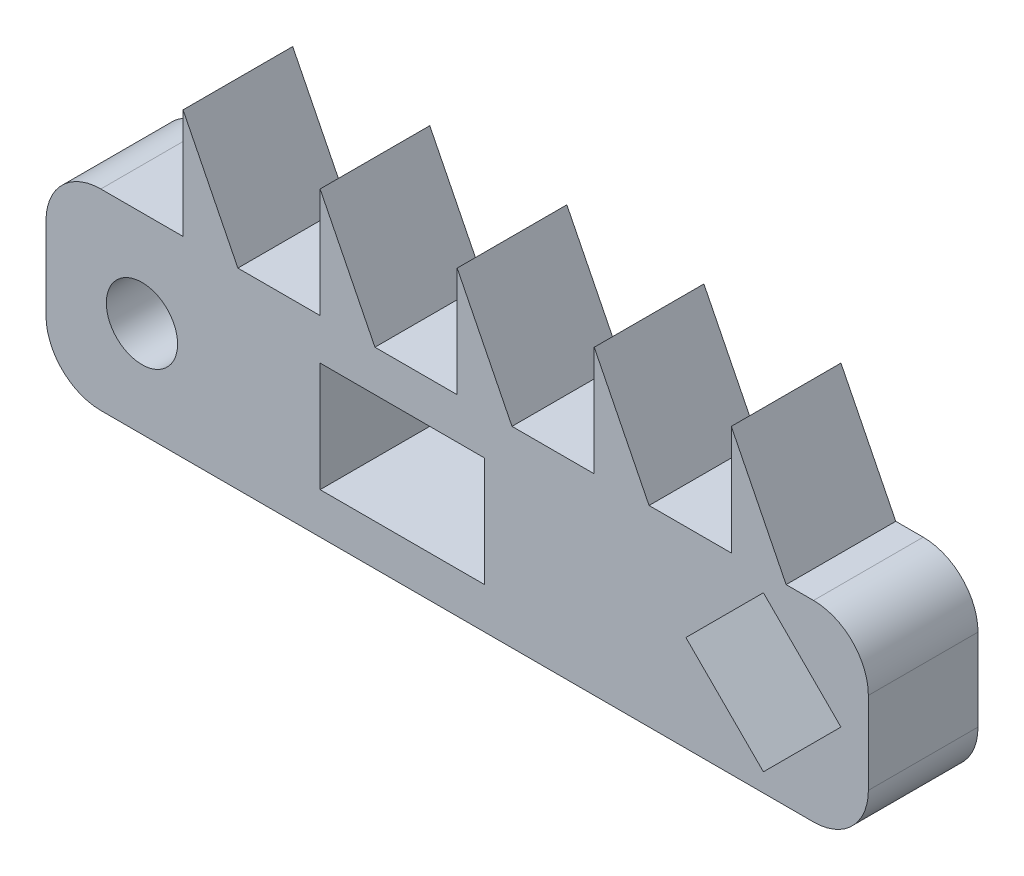
ISO-10303-21;
HEADER;
FILE_DESCRIPTION(('STEP AP214'),'2;1');
FILE_NAME('part.step','',(''),(''),'','','');
FILE_SCHEMA(('AUTOMOTIVE_DESIGN { 1 0 10303 214 1 1 1 1 }'));
ENDSEC;
DATA;
#1=APPLICATION_CONTEXT('core data for automotive mechanical design processes');
#2=APPLICATION_PROTOCOL_DEFINITION('international standard','automotive_design',2000,#1);
#3=PRODUCT_CONTEXT('',#1,'mechanical');
#4=PRODUCT('Part','Part','',(#3));
#5=PRODUCT_RELATED_PRODUCT_CATEGORY('part','',(#4));
#6=PRODUCT_DEFINITION_FORMATION('','',#4);
#7=PRODUCT_DEFINITION_CONTEXT('part definition',#1,'design');
#8=PRODUCT_DEFINITION('design','',#6,#7);
#9=PRODUCT_DEFINITION_SHAPE('','',#8);
#10=(LENGTH_UNIT() NAMED_UNIT(*) SI_UNIT(.MILLI.,.METRE.));
#11=(NAMED_UNIT(*) PLANE_ANGLE_UNIT() SI_UNIT($,.RADIAN.));
#12=(NAMED_UNIT(*) SI_UNIT($,.STERADIAN.) SOLID_ANGLE_UNIT());
#13=UNCERTAINTY_MEASURE_WITH_UNIT(LENGTH_MEASURE(1.E-05),#10,'distance_accuracy_value','');
#14=(GEOMETRIC_REPRESENTATION_CONTEXT(3) GLOBAL_UNCERTAINTY_ASSIGNED_CONTEXT((#13)) GLOBAL_UNIT_ASSIGNED_CONTEXT((#10,
#11,#12)) REPRESENTATION_CONTEXT('',''));
#15=CARTESIAN_POINT('',(0.,0.,0.));
#16=DIRECTION('',(0.,0.,1.));
#17=DIRECTION('',(1.,0.,0.));
#18=AXIS2_PLACEMENT_3D('',#15,#16,#17);
#19=CARTESIAN_POINT('',(2.00000000000001,7.,4.));
#20=DIRECTION('',(0.,-1.,0.));
#21=DIRECTION('',(1.,0.,0.));
#22=AXIS2_PLACEMENT_3D('',#19,#20,#21);
#23=PLANE('',#22);
#24=DIRECTION('',(-1.,0.,0.));
#25=VECTOR('',#24,1.);
#26=CARTESIAN_POINT('',(2.00000000000001,7.,4.));
#27=LINE('',#26,#25);
#28=CARTESIAN_POINT('',(25.,7.,4.));
#29=VERTEX_POINT('',#28);
#30=CARTESIAN_POINT('',(22.,7.,4.));
#31=VERTEX_POINT('',#30);
#32=EDGE_CURVE('E302',#29,#31,#27,.T.);
#33=ORIENTED_EDGE('',*,*,#32,.F.);
#34=DIRECTION('',(0.,0.,1.));
#35=VECTOR('',#34,1.);
#36=CARTESIAN_POINT('',(25.,7.,0.));
#37=LINE('',#36,#35);
#38=CARTESIAN_POINT('',(25.,7.,0.));
#39=VERTEX_POINT('',#38);
#40=EDGE_CURVE('E438',#39,#29,#37,.T.);
#41=ORIENTED_EDGE('',*,*,#40,.F.);
#42=DIRECTION('',(-1.,0.,0.));
#43=VECTOR('',#42,1.);
#44=CARTESIAN_POINT('',(2.00000000000001,7.,0.));
#45=LINE('',#44,#43);
#46=CARTESIAN_POINT('',(22.,7.,0.));
#47=VERTEX_POINT('',#46);
#48=EDGE_CURVE('E265',#39,#47,#45,.T.);
#49=ORIENTED_EDGE('',*,*,#48,.T.);
#50=DIRECTION('',(0.,0.,1.));
#51=VECTOR('',#50,1.);
#52=CARTESIAN_POINT('',(22.,7.,0.));
#53=LINE('',#52,#51);
#54=EDGE_CURVE('E427',#47,#31,#53,.T.);
#55=ORIENTED_EDGE('',*,*,#54,.T.);
#56=EDGE_LOOP('',(#33,#41,#49,#55));
#57=FACE_BOUND('',#56,.T.);
#58=ADVANCED_FACE('F38',(#57),#23,.F.);
#59=CARTESIAN_POINT('',(20.,7.,4.));
#60=VERTEX_POINT('',#59);
#61=CARTESIAN_POINT('',(17.,7.,4.));
#62=VERTEX_POINT('',#61);
#63=EDGE_CURVE('E465',#60,#62,#27,.T.);
#64=ORIENTED_EDGE('',*,*,#63,.F.);
#65=DIRECTION('',(0.,0.,1.));
#66=VECTOR('',#65,1.);
#67=CARTESIAN_POINT('',(20.,7.,0.));
#68=LINE('',#67,#66);
#69=CARTESIAN_POINT('',(20.,7.,0.));
#70=VERTEX_POINT('',#69);
#71=EDGE_CURVE('E423',#70,#60,#68,.T.);
#72=ORIENTED_EDGE('',*,*,#71,.F.);
#73=CARTESIAN_POINT('',(17.,7.,0.));
#74=VERTEX_POINT('',#73);
#75=EDGE_CURVE('E270',#70,#74,#45,.T.);
#76=ORIENTED_EDGE('',*,*,#75,.T.);
#77=DIRECTION('',(0.,0.,1.));
#78=VECTOR('',#77,1.);
#79=CARTESIAN_POINT('',(17.,7.,0.));
#80=LINE('',#79,#78);
#81=EDGE_CURVE('E409',#74,#62,#80,.T.);
#82=ORIENTED_EDGE('',*,*,#81,.T.);
#83=EDGE_LOOP('',(#64,#72,#76,#82));
#84=FACE_BOUND('',#83,.T.);
#85=ADVANCED_FACE('F466',(#84),#23,.F.);
#86=CARTESIAN_POINT('',(15.,7.,4.));
#87=VERTEX_POINT('',#86);
#88=CARTESIAN_POINT('',(12.,7.,4.));
#89=VERTEX_POINT('',#88);
#90=EDGE_CURVE('E469',#87,#89,#27,.T.);
#91=ORIENTED_EDGE('',*,*,#90,.F.);
#92=DIRECTION('',(0.,0.,1.));
#93=VECTOR('',#92,1.);
#94=CARTESIAN_POINT('',(15.,7.,0.));
#95=LINE('',#94,#93);
#96=CARTESIAN_POINT('',(15.,7.,0.));
#97=VERTEX_POINT('',#96);
#98=EDGE_CURVE('E405',#97,#87,#95,.T.);
#99=ORIENTED_EDGE('',*,*,#98,.F.);
#100=CARTESIAN_POINT('',(12.,7.,0.));
#101=VERTEX_POINT('',#100);
#102=EDGE_CURVE('E279',#97,#101,#45,.T.);
#103=ORIENTED_EDGE('',*,*,#102,.T.);
#104=DIRECTION('',(0.,0.,1.));
#105=VECTOR('',#104,1.);
#106=CARTESIAN_POINT('',(12.,7.,0.));
#107=LINE('',#106,#105);
#108=EDGE_CURVE('E391',#101,#89,#107,.T.);
#109=ORIENTED_EDGE('',*,*,#108,.T.);
#110=EDGE_LOOP('',(#91,#99,#103,#109));
#111=FACE_BOUND('',#110,.T.);
#112=ADVANCED_FACE('F535',(#111),#23,.F.);
#113=CARTESIAN_POINT('',(10.,7.,4.));
#114=VERTEX_POINT('',#113);
#115=CARTESIAN_POINT('',(7.00000000000002,7.,4.));
#116=VERTEX_POINT('',#115);
#117=EDGE_CURVE('E470',#114,#116,#27,.T.);
#118=ORIENTED_EDGE('',*,*,#117,.F.);
#119=DIRECTION('',(0.,0.,1.));
#120=VECTOR('',#119,1.);
#121=CARTESIAN_POINT('',(10.,7.,0.));
#122=LINE('',#121,#120);
#123=CARTESIAN_POINT('',(10.,7.,0.));
#124=VERTEX_POINT('',#123);
#125=EDGE_CURVE('E387',#124,#114,#122,.T.);
#126=ORIENTED_EDGE('',*,*,#125,.F.);
#127=CARTESIAN_POINT('',(7.00000000000002,7.,0.));
#128=VERTEX_POINT('',#127);
#129=EDGE_CURVE('E272',#124,#128,#45,.T.);
#130=ORIENTED_EDGE('',*,*,#129,.T.);
#131=DIRECTION('',(0.,0.,1.));
#132=VECTOR('',#131,1.);
#133=CARTESIAN_POINT('',(7.00000000000002,7.,0.));
#134=LINE('',#133,#132);
#135=EDGE_CURVE('E373',#128,#116,#134,.T.);
#136=ORIENTED_EDGE('',*,*,#135,.T.);
#137=EDGE_LOOP('',(#118,#126,#130,#136));
#138=FACE_BOUND('',#137,.T.);
#139=ADVANCED_FACE('F779',(#138),#23,.F.);
#140=CARTESIAN_POINT('',(5.00000000000002,7.,4.));
#141=VERTEX_POINT('',#140);
#142=CARTESIAN_POINT('',(2.00000000000001,7.,4.));
#143=VERTEX_POINT('',#142);
#144=EDGE_CURVE('E303',#141,#143,#27,.T.);
#145=ORIENTED_EDGE('',*,*,#144,.F.);
#146=DIRECTION('',(0.,0.,1.));
#147=VECTOR('',#146,1.);
#148=CARTESIAN_POINT('',(5.00000000000002,7.,0.));
#149=LINE('',#148,#147);
#150=CARTESIAN_POINT('',(5.00000000000002,7.,0.));
#151=VERTEX_POINT('',#150);
#152=EDGE_CURVE('E365',#151,#141,#149,.T.);
#153=ORIENTED_EDGE('',*,*,#152,.F.);
#154=CARTESIAN_POINT('',(2.00000000000001,7.,0.));
#155=VERTEX_POINT('',#154);
#156=EDGE_CURVE('E267',#151,#155,#45,.T.);
#157=ORIENTED_EDGE('',*,*,#156,.T.);
#158=DIRECTION('',(0.,0.,-1.));
#159=VECTOR('',#158,1.);
#160=CARTESIAN_POINT('',(2.00000000000001,7.,4.));
#161=LINE('',#160,#159);
#162=EDGE_CURVE('E46',#143,#155,#161,.T.);
#163=ORIENTED_EDGE('',*,*,#162,.F.);
#164=EDGE_LOOP('',(#145,#153,#157,#163));
#165=FACE_BOUND('',#164,.T.);
#166=ADVANCED_FACE('F479',(#165),#23,.F.);
#167=CARTESIAN_POINT('',(28.,5.,4.));
#168=DIRECTION('',(0.,0.,-1.));
#169=DIRECTION('',(-1.,0.,0.));
#170=AXIS2_PLACEMENT_3D('',#167,#168,#169);
#171=PLANE('',#170);
#172=DIRECTION('',(0.,-1.,0.));
#173=VECTOR('',#172,1.);
#174=CARTESIAN_POINT('',(10.,5.5,4.));
#175=LINE('',#174,#173);
#176=CARTESIAN_POINT('',(10.,5.5,4.));
#177=VERTEX_POINT('',#176);
#178=CARTESIAN_POINT('',(10.,1.5,4.));
#179=VERTEX_POINT('',#178);
#180=EDGE_CURVE('E324',#177,#179,#175,.T.);
#181=ORIENTED_EDGE('',*,*,#180,.F.);
#182=DIRECTION('',(-1.,0.,0.));
#183=VECTOR('',#182,1.);
#184=CARTESIAN_POINT('',(10.,5.5,4.));
#185=LINE('',#184,#183);
#186=CARTESIAN_POINT('',(16.,5.5,4.));
#187=VERTEX_POINT('',#186);
#188=EDGE_CURVE('E320',#187,#177,#185,.T.);
#189=ORIENTED_EDGE('',*,*,#188,.F.);
#190=DIRECTION('',(0.,1.,0.));
#191=VECTOR('',#190,1.);
#192=CARTESIAN_POINT('',(16.,5.5,4.));
#193=LINE('',#192,#191);
#194=CARTESIAN_POINT('',(16.,1.5,4.));
#195=VERTEX_POINT('',#194);
#196=EDGE_CURVE('E336',#195,#187,#193,.T.);
#197=ORIENTED_EDGE('',*,*,#196,.F.);
#198=DIRECTION('',(1.,0.,0.));
#199=VECTOR('',#198,1.);
#200=CARTESIAN_POINT('',(10.,1.5,4.));
#201=LINE('',#200,#199);
#202=EDGE_CURVE('E339',#179,#195,#201,.T.);
#203=ORIENTED_EDGE('',*,*,#202,.F.);
#204=EDGE_LOOP('',(#181,#189,#197,#203));
#205=FACE_BOUND('',#204,.T.);
#206=CARTESIAN_POINT('',(28.,5.,4.));
#207=DIRECTION('',(0.,0.,1.));
#208=DIRECTION('',(-1.,0.,0.));
#209=AXIS2_PLACEMENT_3D('',#206,#207,#208);
#210=CIRCLE('',#209,2.);
#211=CARTESIAN_POINT('',(30.,4.99999999999999,4.));
#212=VERTEX_POINT('',#211);
#213=CARTESIAN_POINT('',(28.,7.,4.));
#214=VERTEX_POINT('',#213);
#215=EDGE_CURVE('E304',#212,#214,#210,.T.);
#216=ORIENTED_EDGE('',*,*,#215,.T.);
#217=CARTESIAN_POINT('',(27.,7.,4.));
#218=VERTEX_POINT('',#217);
#219=EDGE_CURVE('E300',#214,#218,#27,.T.);
#220=ORIENTED_EDGE('',*,*,#219,.T.);
#221=DIRECTION('',(-0.447213595499958,0.894427190999916,0.));
#222=VECTOR('',#221,1.);
#223=CARTESIAN_POINT('',(25.,11.,4.));
#224=LINE('',#223,#222);
#225=CARTESIAN_POINT('',(25.,11.,4.));
#226=VERTEX_POINT('',#225);
#227=EDGE_CURVE('E247',#218,#226,#224,.T.);
#228=ORIENTED_EDGE('',*,*,#227,.T.);
#229=DIRECTION('',(0.,-1.,0.));
#230=VECTOR('',#229,1.);
#231=CARTESIAN_POINT('',(25.,7.,4.));
#232=LINE('',#231,#230);
#233=EDGE_CURVE('E53',#226,#29,#232,.T.);
#234=ORIENTED_EDGE('',*,*,#233,.T.);
#235=ORIENTED_EDGE('',*,*,#32,.T.);
#236=DIRECTION('',(-0.447213595499958,0.894427190999916,0.));
#237=VECTOR('',#236,1.);
#238=CARTESIAN_POINT('',(20.,11.,4.));
#239=LINE('',#238,#237);
#240=CARTESIAN_POINT('',(20.,11.,4.));
#241=VERTEX_POINT('',#240);
#242=EDGE_CURVE('E436',#31,#241,#239,.T.);
#243=ORIENTED_EDGE('',*,*,#242,.T.);
#244=DIRECTION('',(0.,-1.,0.));
#245=VECTOR('',#244,1.);
#246=CARTESIAN_POINT('',(20.,7.,4.));
#247=LINE('',#246,#245);
#248=EDGE_CURVE('E60',#241,#60,#247,.T.);
#249=ORIENTED_EDGE('',*,*,#248,.T.);
#250=ORIENTED_EDGE('',*,*,#63,.T.);
#251=DIRECTION('',(-0.447213595499958,0.894427190999916,0.));
#252=VECTOR('',#251,1.);
#253=CARTESIAN_POINT('',(15.,11.,4.));
#254=LINE('',#253,#252);
#255=CARTESIAN_POINT('',(15.,11.,4.));
#256=VERTEX_POINT('',#255);
#257=EDGE_CURVE('E420',#62,#256,#254,.T.);
#258=ORIENTED_EDGE('',*,*,#257,.T.);
#259=DIRECTION('',(0.,-1.,0.));
#260=VECTOR('',#259,1.);
#261=CARTESIAN_POINT('',(15.,7.,4.));
#262=LINE('',#261,#260);
#263=EDGE_CURVE('E417',#256,#87,#262,.T.);
#264=ORIENTED_EDGE('',*,*,#263,.T.);
#265=ORIENTED_EDGE('',*,*,#90,.T.);
#266=DIRECTION('',(-0.447213595499958,0.894427190999916,0.));
#267=VECTOR('',#266,1.);
#268=CARTESIAN_POINT('',(10.,11.,4.));
#269=LINE('',#268,#267);
#270=CARTESIAN_POINT('',(10.,11.,4.));
#271=VERTEX_POINT('',#270);
#272=EDGE_CURVE('E402',#89,#271,#269,.T.);
#273=ORIENTED_EDGE('',*,*,#272,.T.);
#274=DIRECTION('',(0.,-1.,0.));
#275=VECTOR('',#274,1.);
#276=CARTESIAN_POINT('',(10.,7.,4.));
#277=LINE('',#276,#275);
#278=EDGE_CURVE('E399',#271,#114,#277,.T.);
#279=ORIENTED_EDGE('',*,*,#278,.T.);
#280=ORIENTED_EDGE('',*,*,#117,.T.);
#281=DIRECTION('',(-0.447213595499958,0.894427190999916,0.));
#282=VECTOR('',#281,1.);
#283=CARTESIAN_POINT('',(5.00000000000002,11.,4.));
#284=LINE('',#283,#282);
#285=CARTESIAN_POINT('',(5.00000000000002,11.,4.));
#286=VERTEX_POINT('',#285);
#287=EDGE_CURVE('E384',#116,#286,#284,.T.);
#288=ORIENTED_EDGE('',*,*,#287,.T.);
#289=DIRECTION('',(0.,-1.,0.));
#290=VECTOR('',#289,1.);
#291=CARTESIAN_POINT('',(5.00000000000002,7.,4.));
#292=LINE('',#291,#290);
#293=EDGE_CURVE('E381',#286,#141,#292,.T.);
#294=ORIENTED_EDGE('',*,*,#293,.T.);
#295=ORIENTED_EDGE('',*,*,#144,.T.);
#296=CARTESIAN_POINT('',(2.,5.,4.));
#297=DIRECTION('',(0.,0.,1.));
#298=DIRECTION('',(-1.,0.,0.));
#299=AXIS2_PLACEMENT_3D('',#296,#297,#298);
#300=CIRCLE('',#299,2.);
#301=CARTESIAN_POINT('',(0.,4.99999999999999,4.));
#302=VERTEX_POINT('',#301);
#303=EDGE_CURVE('E298',#143,#302,#300,.T.);
#304=ORIENTED_EDGE('',*,*,#303,.T.);
#305=DIRECTION('',(0.,-1.,0.));
#306=VECTOR('',#305,1.);
#307=CARTESIAN_POINT('',(0.,2.00000000000001,4.));
#308=LINE('',#307,#306);
#309=CARTESIAN_POINT('',(0.,2.00000000000001,4.));
#310=VERTEX_POINT('',#309);
#311=EDGE_CURVE('E296',#302,#310,#308,.T.);
#312=ORIENTED_EDGE('',*,*,#311,.T.);
#313=CARTESIAN_POINT('',(2.,2.,4.));
#314=DIRECTION('',(0.,0.,1.));
#315=DIRECTION('',(-1.,0.,0.));
#316=AXIS2_PLACEMENT_3D('',#313,#314,#315);
#317=CIRCLE('',#316,2.);
#318=CARTESIAN_POINT('',(2.00000000000001,0.,4.));
#319=VERTEX_POINT('',#318);
#320=EDGE_CURVE('E294',#310,#319,#317,.T.);
#321=ORIENTED_EDGE('',*,*,#320,.T.);
#322=DIRECTION('',(1.,0.,0.));
#323=VECTOR('',#322,1.);
#324=CARTESIAN_POINT('',(2.00000000000001,0.,4.));
#325=LINE('',#324,#323);
#326=CARTESIAN_POINT('',(28.,0.,4.));
#327=VERTEX_POINT('',#326);
#328=EDGE_CURVE('E292',#319,#327,#325,.T.);
#329=ORIENTED_EDGE('',*,*,#328,.T.);
#330=CARTESIAN_POINT('',(28.,2.,4.));
#331=DIRECTION('',(0.,0.,1.));
#332=DIRECTION('',(1.,0.,0.));
#333=AXIS2_PLACEMENT_3D('',#330,#331,#332);
#334=CIRCLE('',#333,2.);
#335=CARTESIAN_POINT('',(30.,2.,4.));
#336=VERTEX_POINT('',#335);
#337=EDGE_CURVE('E290',#327,#336,#334,.T.);
#338=ORIENTED_EDGE('',*,*,#337,.T.);
#339=DIRECTION('',(0.,1.,0.));
#340=VECTOR('',#339,1.);
#341=CARTESIAN_POINT('',(30.,2.00000000000001,4.));
#342=LINE('',#341,#340);
#343=EDGE_CURVE('E287',#336,#212,#342,.T.);
#344=ORIENTED_EDGE('',*,*,#343,.T.);
#345=EDGE_LOOP('',(#216,#220,#228,#234,#235,#243,#249,#250,#258,#264,#265,#273,#279,#280,#288,
#294,#295,#304,#312,#321,#329,#338,#344));
#346=FACE_BOUND('',#345,.T.);
#347=CARTESIAN_POINT('',(3.5,3.5,4.));
#348=DIRECTION('',(0.,0.,1.));
#349=DIRECTION('',(1.,0.,0.));
#350=AXIS2_PLACEMENT_3D('',#347,#348,#349);
#351=CIRCLE('',#350,1.3);
#352=CARTESIAN_POINT('',(4.8,3.5,4.));
#353=VERTEX_POINT('',#352);
#354=EDGE_CURVE('E280',#353,#353,#351,.T.);
#355=ORIENTED_EDGE('',*,*,#354,.F.);
#356=EDGE_LOOP('',(#355));
#357=FACE_BOUND('',#356,.T.);
#358=DIRECTION('',(0.707106781186547,-0.707106781186548,0.));
#359=VECTOR('',#358,1.);
#360=CARTESIAN_POINT('',(26.1715728752538,0.671572875253809,4.));
#361=LINE('',#360,#359);
#362=CARTESIAN_POINT('',(23.3431457505076,3.50000000000002,4.));
#363=VERTEX_POINT('',#362);
#364=CARTESIAN_POINT('',(26.1715728752538,0.671572875253809,4.));
#365=VERTEX_POINT('',#364);
#366=EDGE_CURVE('E355',#363,#365,#361,.T.);
#367=ORIENTED_EDGE('',*,*,#366,.F.);
#368=DIRECTION('',(-0.707106781186547,-0.707106781186548,0.));
#369=VECTOR('',#368,1.);
#370=CARTESIAN_POINT('',(23.3431457505076,3.50000000000002,4.));
#371=LINE('',#370,#369);
#372=CARTESIAN_POINT('',(26.1715728752538,6.32842712474619,4.));
#373=VERTEX_POINT('',#372);
#374=EDGE_CURVE('E351',#373,#363,#371,.T.);
#375=ORIENTED_EDGE('',*,*,#374,.F.);
#376=DIRECTION('',(-0.707106781186552,0.707106781186543,0.));
#377=VECTOR('',#376,1.);
#378=CARTESIAN_POINT('',(26.1715728752538,6.32842712474619,4.));
#379=LINE('',#378,#377);
#380=CARTESIAN_POINT('',(29.,3.50000000000002,4.));
#381=VERTEX_POINT('',#380);
#382=EDGE_CURVE('E367',#381,#373,#379,.T.);
#383=ORIENTED_EDGE('',*,*,#382,.F.);
#384=DIRECTION('',(0.707106781186544,0.707106781186551,0.));
#385=VECTOR('',#384,1.);
#386=CARTESIAN_POINT('',(29.,3.50000000000002,4.));
#387=LINE('',#386,#385);
#388=EDGE_CURVE('E370',#365,#381,#387,.T.);
#389=ORIENTED_EDGE('',*,*,#388,.F.);
#390=EDGE_LOOP('',(#367,#375,#383,#389));
#391=FACE_BOUND('',#390,.T.);
#392=ADVANCED_FACE('F458',(#205,#346,#357,#391),#171,.F.);
#393=CARTESIAN_POINT('',(28.,5.,0.));
#394=DIRECTION('',(0.,0.,-1.));
#395=DIRECTION('',(-1.,0.,0.));
#396=AXIS2_PLACEMENT_3D('',#393,#394,#395);
#397=PLANE('',#396);
#398=CARTESIAN_POINT('',(28.,5.,0.));
#399=DIRECTION('',(0.,0.,1.));
#400=DIRECTION('',(-1.,0.,0.));
#401=AXIS2_PLACEMENT_3D('',#398,#399,#400);
#402=CIRCLE('',#401,2.);
#403=CARTESIAN_POINT('',(30.,4.99999999999999,0.));
#404=VERTEX_POINT('',#403);
#405=CARTESIAN_POINT('',(28.,7.,0.));
#406=VERTEX_POINT('',#405);
#407=EDGE_CURVE('E273',#404,#406,#402,.T.);
#408=ORIENTED_EDGE('',*,*,#407,.F.);
#409=DIRECTION('',(0.,1.,0.));
#410=VECTOR('',#409,1.);
#411=CARTESIAN_POINT('',(30.,2.00000000000001,0.));
#412=LINE('',#411,#410);
#413=CARTESIAN_POINT('',(30.,2.,0.));
#414=VERTEX_POINT('',#413);
#415=EDGE_CURVE('E307',#414,#404,#412,.T.);
#416=ORIENTED_EDGE('',*,*,#415,.F.);
#417=CARTESIAN_POINT('',(28.,2.,0.));
#418=DIRECTION('',(0.,0.,1.));
#419=DIRECTION('',(1.,0.,0.));
#420=AXIS2_PLACEMENT_3D('',#417,#418,#419);
#421=CIRCLE('',#420,2.);
#422=CARTESIAN_POINT('',(28.,0.,0.));
#423=VERTEX_POINT('',#422);
#424=EDGE_CURVE('E807',#423,#414,#421,.T.);
#425=ORIENTED_EDGE('',*,*,#424,.F.);
#426=DIRECTION('',(1.,0.,0.));
#427=VECTOR('',#426,1.);
#428=CARTESIAN_POINT('',(2.00000000000001,0.,0.));
#429=LINE('',#428,#427);
#430=CARTESIAN_POINT('',(2.00000000000001,0.,0.));
#431=VERTEX_POINT('',#430);
#432=EDGE_CURVE('E510',#431,#423,#429,.T.);
#433=ORIENTED_EDGE('',*,*,#432,.F.);
#434=CARTESIAN_POINT('',(2.,2.,0.));
#435=DIRECTION('',(0.,0.,1.));
#436=DIRECTION('',(-1.,0.,0.));
#437=AXIS2_PLACEMENT_3D('',#434,#435,#436);
#438=CIRCLE('',#437,2.);
#439=CARTESIAN_POINT('',(0.,2.00000000000001,0.));
#440=VERTEX_POINT('',#439);
#441=EDGE_CURVE('E502',#440,#431,#438,.T.);
#442=ORIENTED_EDGE('',*,*,#441,.F.);
#443=DIRECTION('',(0.,-1.,0.));
#444=VECTOR('',#443,1.);
#445=CARTESIAN_POINT('',(0.,2.00000000000001,0.));
#446=LINE('',#445,#444);
#447=CARTESIAN_POINT('',(0.,4.99999999999999,0.));
#448=VERTEX_POINT('',#447);
#449=EDGE_CURVE('E268',#448,#440,#446,.T.);
#450=ORIENTED_EDGE('',*,*,#449,.F.);
#451=CARTESIAN_POINT('',(2.,5.,0.));
#452=DIRECTION('',(0.,0.,1.));
#453=DIRECTION('',(-1.,0.,0.));
#454=AXIS2_PLACEMENT_3D('',#451,#452,#453);
#455=CIRCLE('',#454,2.);
#456=EDGE_CURVE('E264',#155,#448,#455,.T.);
#457=ORIENTED_EDGE('',*,*,#456,.F.);
#458=ORIENTED_EDGE('',*,*,#156,.F.);
#459=DIRECTION('',(0.,-1.,0.));
#460=VECTOR('',#459,1.);
#461=CARTESIAN_POINT('',(5.00000000000002,7.,0.));
#462=LINE('',#461,#460);
#463=CARTESIAN_POINT('',(5.00000000000002,11.,0.));
#464=VERTEX_POINT('',#463);
#465=EDGE_CURVE('E377',#464,#151,#462,.T.);
#466=ORIENTED_EDGE('',*,*,#465,.F.);
#467=DIRECTION('',(-0.447213595499958,0.894427190999916,0.));
#468=VECTOR('',#467,1.);
#469=CARTESIAN_POINT('',(5.00000000000002,11.,0.));
#470=LINE('',#469,#468);
#471=EDGE_CURVE('E383',#128,#464,#470,.T.);
#472=ORIENTED_EDGE('',*,*,#471,.F.);
#473=ORIENTED_EDGE('',*,*,#129,.F.);
#474=DIRECTION('',(0.,-1.,0.));
#475=VECTOR('',#474,1.);
#476=CARTESIAN_POINT('',(10.,7.,0.));
#477=LINE('',#476,#475);
#478=CARTESIAN_POINT('',(10.,11.,0.));
#479=VERTEX_POINT('',#478);
#480=EDGE_CURVE('E395',#479,#124,#477,.T.);
#481=ORIENTED_EDGE('',*,*,#480,.F.);
#482=DIRECTION('',(-0.447213595499958,0.894427190999916,0.));
#483=VECTOR('',#482,1.);
#484=CARTESIAN_POINT('',(10.,11.,0.));
#485=LINE('',#484,#483);
#486=EDGE_CURVE('E401',#101,#479,#485,.T.);
#487=ORIENTED_EDGE('',*,*,#486,.F.);
#488=ORIENTED_EDGE('',*,*,#102,.F.);
#489=DIRECTION('',(0.,-1.,0.));
#490=VECTOR('',#489,1.);
#491=CARTESIAN_POINT('',(15.,7.,0.));
#492=LINE('',#491,#490);
#493=CARTESIAN_POINT('',(15.,11.,0.));
#494=VERTEX_POINT('',#493);
#495=EDGE_CURVE('E413',#494,#97,#492,.T.);
#496=ORIENTED_EDGE('',*,*,#495,.F.);
#497=DIRECTION('',(-0.447213595499958,0.894427190999916,0.));
#498=VECTOR('',#497,1.);
#499=CARTESIAN_POINT('',(15.,11.,0.));
#500=LINE('',#499,#498);
#501=EDGE_CURVE('E419',#74,#494,#500,.T.);
#502=ORIENTED_EDGE('',*,*,#501,.F.);
#503=ORIENTED_EDGE('',*,*,#75,.F.);
#504=DIRECTION('',(0.,-1.,0.));
#505=VECTOR('',#504,1.);
#506=CARTESIAN_POINT('',(20.,7.,0.));
#507=LINE('',#506,#505);
#508=CARTESIAN_POINT('',(20.,11.,0.));
#509=VERTEX_POINT('',#508);
#510=EDGE_CURVE('E431',#509,#70,#507,.T.);
#511=ORIENTED_EDGE('',*,*,#510,.F.);
#512=DIRECTION('',(-0.447213595499958,0.894427190999916,0.));
#513=VECTOR('',#512,1.);
#514=CARTESIAN_POINT('',(20.,11.,0.));
#515=LINE('',#514,#513);
#516=EDGE_CURVE('E435',#47,#509,#515,.T.);
#517=ORIENTED_EDGE('',*,*,#516,.F.);
#518=ORIENTED_EDGE('',*,*,#48,.F.);
#519=DIRECTION('',(0.,-1.,0.));
#520=VECTOR('',#519,1.);
#521=CARTESIAN_POINT('',(25.,7.,0.));
#522=LINE('',#521,#520);
#523=CARTESIAN_POINT('',(25.,11.,0.));
#524=VERTEX_POINT('',#523);
#525=EDGE_CURVE('E252',#524,#39,#522,.T.);
#526=ORIENTED_EDGE('',*,*,#525,.F.);
#527=DIRECTION('',(-0.447213595499958,0.894427190999916,0.));
#528=VECTOR('',#527,1.);
#529=CARTESIAN_POINT('',(25.,11.,0.));
#530=LINE('',#529,#528);
#531=CARTESIAN_POINT('',(27.,7.,0.));
#532=VERTEX_POINT('',#531);
#533=EDGE_CURVE('E245',#532,#524,#530,.T.);
#534=ORIENTED_EDGE('',*,*,#533,.F.);
#535=EDGE_CURVE('E258',#406,#532,#45,.T.);
#536=ORIENTED_EDGE('',*,*,#535,.F.);
#537=EDGE_LOOP('',(#408,#416,#425,#433,#442,#450,#457,#458,#466,#472,#473,#481,#487,#488,#496,
#502,#503,#511,#517,#518,#526,#534,#536));
#538=FACE_BOUND('',#537,.T.);
#539=CARTESIAN_POINT('',(3.5,3.5,0.));
#540=DIRECTION('',(0.,0.,1.));
#541=DIRECTION('',(1.,0.,0.));
#542=AXIS2_PLACEMENT_3D('',#539,#540,#541);
#543=CIRCLE('',#542,1.3);
#544=CARTESIAN_POINT('',(4.8,3.5,0.));
#545=VERTEX_POINT('',#544);
#546=EDGE_CURVE('E284',#545,#545,#543,.T.);
#547=ORIENTED_EDGE('',*,*,#546,.T.);
#548=EDGE_LOOP('',(#547));
#549=FACE_BOUND('',#548,.T.);
#550=DIRECTION('',(-1.,0.,0.));
#551=VECTOR('',#550,1.);
#552=CARTESIAN_POINT('',(10.,5.5,0.));
#553=LINE('',#552,#551);
#554=CARTESIAN_POINT('',(16.,5.5,0.));
#555=VERTEX_POINT('',#554);
#556=CARTESIAN_POINT('',(10.,5.5,0.));
#557=VERTEX_POINT('',#556);
#558=EDGE_CURVE('E321',#555,#557,#553,.T.);
#559=ORIENTED_EDGE('',*,*,#558,.T.);
#560=DIRECTION('',(0.,-1.,0.));
#561=VECTOR('',#560,1.);
#562=CARTESIAN_POINT('',(10.,5.5,0.));
#563=LINE('',#562,#561);
#564=CARTESIAN_POINT('',(10.,1.5,0.));
#565=VERTEX_POINT('',#564);
#566=EDGE_CURVE('E331',#557,#565,#563,.T.);
#567=ORIENTED_EDGE('',*,*,#566,.T.);
#568=DIRECTION('',(1.,0.,0.));
#569=VECTOR('',#568,1.);
#570=CARTESIAN_POINT('',(10.,1.5,0.));
#571=LINE('',#570,#569);
#572=CARTESIAN_POINT('',(16.,1.5,0.));
#573=VERTEX_POINT('',#572);
#574=EDGE_CURVE('E328',#565,#573,#571,.T.);
#575=ORIENTED_EDGE('',*,*,#574,.T.);
#576=DIRECTION('',(0.,1.,0.));
#577=VECTOR('',#576,1.);
#578=CARTESIAN_POINT('',(16.,5.5,0.));
#579=LINE('',#578,#577);
#580=EDGE_CURVE('E325',#573,#555,#579,.T.);
#581=ORIENTED_EDGE('',*,*,#580,.T.);
#582=EDGE_LOOP('',(#559,#567,#575,#581));
#583=FACE_BOUND('',#582,.T.);
#584=DIRECTION('',(-0.707106781186547,-0.707106781186548,0.));
#585=VECTOR('',#584,1.);
#586=CARTESIAN_POINT('',(23.3431457505076,3.50000000000002,0.));
#587=LINE('',#586,#585);
#588=CARTESIAN_POINT('',(26.1715728752538,6.32842712474619,0.));
#589=VERTEX_POINT('',#588);
#590=CARTESIAN_POINT('',(23.3431457505076,3.50000000000002,0.));
#591=VERTEX_POINT('',#590);
#592=EDGE_CURVE('E352',#589,#591,#587,.T.);
#593=ORIENTED_EDGE('',*,*,#592,.T.);
#594=DIRECTION('',(0.707106781186547,-0.707106781186548,0.));
#595=VECTOR('',#594,1.);
#596=CARTESIAN_POINT('',(26.1715728752538,0.671572875253809,0.));
#597=LINE('',#596,#595);
#598=CARTESIAN_POINT('',(26.1715728752538,0.671572875253809,0.));
#599=VERTEX_POINT('',#598);
#600=EDGE_CURVE('E362',#591,#599,#597,.T.);
#601=ORIENTED_EDGE('',*,*,#600,.T.);
#602=DIRECTION('',(0.707106781186544,0.707106781186551,0.));
#603=VECTOR('',#602,1.);
#604=CARTESIAN_POINT('',(29.,3.50000000000002,0.));
#605=LINE('',#604,#603);
#606=CARTESIAN_POINT('',(29.,3.50000000000002,0.));
#607=VERTEX_POINT('',#606);
#608=EDGE_CURVE('E359',#599,#607,#605,.T.);
#609=ORIENTED_EDGE('',*,*,#608,.T.);
#610=DIRECTION('',(-0.707106781186552,0.707106781186543,0.));
#611=VECTOR('',#610,1.);
#612=CARTESIAN_POINT('',(26.1715728752538,6.32842712474619,0.));
#613=LINE('',#612,#611);
#614=EDGE_CURVE('E356',#607,#589,#613,.T.);
#615=ORIENTED_EDGE('',*,*,#614,.T.);
#616=EDGE_LOOP('',(#593,#601,#609,#615));
#617=FACE_BOUND('',#616,.T.);
#618=ADVANCED_FACE('F256',(#538,#549,#583,#617),#397,.T.);
#619=CARTESIAN_POINT('',(28.,5.,4.));
#620=DIRECTION('',(0.,0.,-1.));
#621=DIRECTION('',(-1.,0.,0.));
#622=AXIS2_PLACEMENT_3D('',#619,#620,#621);
#623=CYLINDRICAL_SURFACE('',#622,2.);
#624=ORIENTED_EDGE('',*,*,#407,.T.);
#625=DIRECTION('',(0.,0.,-1.));
#626=VECTOR('',#625,1.);
#627=CARTESIAN_POINT('',(28.,7.,4.));
#628=LINE('',#627,#626);
#629=EDGE_CURVE('E11',#214,#406,#628,.T.);
#630=ORIENTED_EDGE('',*,*,#629,.F.);
#631=ORIENTED_EDGE('',*,*,#215,.F.);
#632=DIRECTION('',(0.,0.,-1.));
#633=VECTOR('',#632,1.);
#634=CARTESIAN_POINT('',(30.,4.99999999999999,4.));
#635=LINE('',#634,#633);
#636=EDGE_CURVE('E289',#212,#404,#635,.T.);
#637=ORIENTED_EDGE('',*,*,#636,.T.);
#638=EDGE_LOOP('',(#624,#630,#631,#637));
#639=FACE_BOUND('',#638,.T.);
#640=ADVANCED_FACE('F40',(#639),#623,.T.);
#641=ORIENTED_EDGE('',*,*,#535,.T.);
#642=DIRECTION('',(0.,0.,1.));
#643=VECTOR('',#642,1.);
#644=CARTESIAN_POINT('',(27.,7.,0.));
#645=LINE('',#644,#643);
#646=EDGE_CURVE('E242',#532,#218,#645,.T.);
#647=ORIENTED_EDGE('',*,*,#646,.T.);
#648=ORIENTED_EDGE('',*,*,#219,.F.);
#649=ORIENTED_EDGE('',*,*,#629,.T.);
#650=EDGE_LOOP('',(#641,#647,#648,#649));
#651=FACE_BOUND('',#650,.T.);
#652=ADVANCED_FACE('F261',(#651),#23,.F.);
#653=CARTESIAN_POINT('',(2.,5.,4.));
#654=DIRECTION('',(0.,0.,-1.));
#655=DIRECTION('',(-1.,0.,0.));
#656=AXIS2_PLACEMENT_3D('',#653,#654,#655);
#657=CYLINDRICAL_SURFACE('',#656,2.);
#658=ORIENTED_EDGE('',*,*,#456,.T.);
#659=DIRECTION('',(0.,0.,-1.));
#660=VECTOR('',#659,1.);
#661=CARTESIAN_POINT('',(0.,4.99999999999999,4.));
#662=LINE('',#661,#660);
#663=EDGE_CURVE('E482',#302,#448,#662,.T.);
#664=ORIENTED_EDGE('',*,*,#663,.F.);
#665=ORIENTED_EDGE('',*,*,#303,.F.);
#666=ORIENTED_EDGE('',*,*,#162,.T.);
#667=EDGE_LOOP('',(#658,#664,#665,#666));
#668=FACE_BOUND('',#667,.T.);
#669=ADVANCED_FACE('F483',(#668),#657,.T.);
#670=CARTESIAN_POINT('',(0.,2.00000000000001,4.));
#671=DIRECTION('',(1.,0.,0.));
#672=DIRECTION('',(0.,0.,-1.));
#673=AXIS2_PLACEMENT_3D('',#670,#671,#672);
#674=PLANE('',#673);
#675=ORIENTED_EDGE('',*,*,#449,.T.);
#676=DIRECTION('',(0.,0.,-1.));
#677=VECTOR('',#676,1.);
#678=CARTESIAN_POINT('',(0.,2.00000000000001,4.));
#679=LINE('',#678,#677);
#680=EDGE_CURVE('E488',#310,#440,#679,.T.);
#681=ORIENTED_EDGE('',*,*,#680,.F.);
#682=ORIENTED_EDGE('',*,*,#311,.F.);
#683=ORIENTED_EDGE('',*,*,#663,.T.);
#684=EDGE_LOOP('',(#675,#681,#682,#683));
#685=FACE_BOUND('',#684,.T.);
#686=ADVANCED_FACE('F491',(#685),#674,.F.);
#687=CARTESIAN_POINT('',(2.,2.,4.));
#688=DIRECTION('',(0.,0.,-1.));
#689=DIRECTION('',(-1.,0.,0.));
#690=AXIS2_PLACEMENT_3D('',#687,#688,#689);
#691=CYLINDRICAL_SURFACE('',#690,2.);
#692=ORIENTED_EDGE('',*,*,#441,.T.);
#693=DIRECTION('',(0.,0.,-1.));
#694=VECTOR('',#693,1.);
#695=CARTESIAN_POINT('',(2.00000000000001,0.,4.));
#696=LINE('',#695,#694);
#697=EDGE_CURVE('E499',#319,#431,#696,.T.);
#698=ORIENTED_EDGE('',*,*,#697,.F.);
#699=ORIENTED_EDGE('',*,*,#320,.F.);
#700=ORIENTED_EDGE('',*,*,#680,.T.);
#701=EDGE_LOOP('',(#692,#698,#699,#700));
#702=FACE_BOUND('',#701,.T.);
#703=ADVANCED_FACE('F500',(#702),#691,.T.);
#704=CARTESIAN_POINT('',(2.00000000000001,0.,4.));
#705=DIRECTION('',(0.,1.,0.));
#706=DIRECTION('',(-1.,0.,0.));
#707=AXIS2_PLACEMENT_3D('',#704,#705,#706);
#708=PLANE('',#707);
#709=ORIENTED_EDGE('',*,*,#432,.T.);
#710=DIRECTION('',(0.,0.,-1.));
#711=VECTOR('',#710,1.);
#712=CARTESIAN_POINT('',(28.,0.,4.));
#713=LINE('',#712,#711);
#714=EDGE_CURVE('E505',#327,#423,#713,.T.);
#715=ORIENTED_EDGE('',*,*,#714,.F.);
#716=ORIENTED_EDGE('',*,*,#328,.F.);
#717=ORIENTED_EDGE('',*,*,#697,.T.);
#718=EDGE_LOOP('',(#709,#715,#716,#717));
#719=FACE_BOUND('',#718,.T.);
#720=ADVANCED_FACE('F507',(#719),#708,.F.);
#721=CARTESIAN_POINT('',(28.,2.,4.));
#722=DIRECTION('',(0.,0.,-1.));
#723=DIRECTION('',(-1.,0.,0.));
#724=AXIS2_PLACEMENT_3D('',#721,#722,#723);
#725=CYLINDRICAL_SURFACE('',#724,2.);
#726=ORIENTED_EDGE('',*,*,#424,.T.);
#727=DIRECTION('',(0.,0.,-1.));
#728=VECTOR('',#727,1.);
#729=CARTESIAN_POINT('',(30.,2.,4.));
#730=LINE('',#729,#728);
#731=EDGE_CURVE('E513',#336,#414,#730,.T.);
#732=ORIENTED_EDGE('',*,*,#731,.F.);
#733=ORIENTED_EDGE('',*,*,#337,.F.);
#734=ORIENTED_EDGE('',*,*,#714,.T.);
#735=EDGE_LOOP('',(#726,#732,#733,#734));
#736=FACE_BOUND('',#735,.T.);
#737=ADVANCED_FACE('F516',(#736),#725,.T.);
#738=CARTESIAN_POINT('',(30.,2.00000000000001,4.));
#739=DIRECTION('',(-1.,0.,0.));
#740=DIRECTION('',(0.,0.,1.));
#741=AXIS2_PLACEMENT_3D('',#738,#739,#740);
#742=PLANE('',#741);
#743=ORIENTED_EDGE('',*,*,#415,.T.);
#744=ORIENTED_EDGE('',*,*,#636,.F.);
#745=ORIENTED_EDGE('',*,*,#343,.F.);
#746=ORIENTED_EDGE('',*,*,#731,.T.);
#747=EDGE_LOOP('',(#743,#744,#745,#746));
#748=FACE_BOUND('',#747,.T.);
#749=ADVANCED_FACE('F522',(#748),#742,.F.);
#750=CARTESIAN_POINT('',(3.5,3.5,4.));
#751=DIRECTION('',(0.,0.,-1.));
#752=DIRECTION('',(-1.,0.,0.));
#753=AXIS2_PLACEMENT_3D('',#750,#751,#752);
#754=CYLINDRICAL_SURFACE('',#753,1.3);
#755=ORIENTED_EDGE('',*,*,#354,.T.);
#756=EDGE_LOOP('',(#755));
#757=FACE_BOUND('',#756,.T.);
#758=ORIENTED_EDGE('',*,*,#546,.F.);
#759=EDGE_LOOP('',(#758));
#760=FACE_BOUND('',#759,.T.);
#761=ADVANCED_FACE('F548',(#757,#760),#754,.F.);
#762=CARTESIAN_POINT('',(10.,5.5,4.));
#763=DIRECTION('',(1.,0.,0.));
#764=DIRECTION('',(0.,0.,-1.));
#765=AXIS2_PLACEMENT_3D('',#762,#763,#764);
#766=PLANE('',#765);
#767=ORIENTED_EDGE('',*,*,#566,.F.);
#768=DIRECTION('',(0.,0.,-1.));
#769=VECTOR('',#768,1.);
#770=CARTESIAN_POINT('',(10.,5.5,4.));
#771=LINE('',#770,#769);
#772=EDGE_CURVE('E317',#177,#557,#771,.T.);
#773=ORIENTED_EDGE('',*,*,#772,.F.);
#774=ORIENTED_EDGE('',*,*,#180,.T.);
#775=DIRECTION('',(0.,0.,-1.));
#776=VECTOR('',#775,1.);
#777=CARTESIAN_POINT('',(10.,1.5,4.));
#778=LINE('',#777,#776);
#779=EDGE_CURVE('E309',#179,#565,#778,.T.);
#780=ORIENTED_EDGE('',*,*,#779,.T.);
#781=EDGE_LOOP('',(#767,#773,#774,#780));
#782=FACE_BOUND('',#781,.T.);
#783=ADVANCED_FACE('F555',(#782),#766,.T.);
#784=CARTESIAN_POINT('',(10.,1.5,4.));
#785=DIRECTION('',(0.,1.,0.));
#786=DIRECTION('',(0.,0.,1.));
#787=AXIS2_PLACEMENT_3D('',#784,#785,#786);
#788=PLANE('',#787);
#789=ORIENTED_EDGE('',*,*,#574,.F.);
#790=ORIENTED_EDGE('',*,*,#779,.F.);
#791=ORIENTED_EDGE('',*,*,#202,.T.);
#792=DIRECTION('',(0.,0.,-1.));
#793=VECTOR('',#792,1.);
#794=CARTESIAN_POINT('',(16.,1.5,4.));
#795=LINE('',#794,#793);
#796=EDGE_CURVE('E313',#195,#573,#795,.T.);
#797=ORIENTED_EDGE('',*,*,#796,.T.);
#798=EDGE_LOOP('',(#789,#790,#791,#797));
#799=FACE_BOUND('',#798,.T.);
#800=ADVANCED_FACE('F559',(#799),#788,.T.);
#801=CARTESIAN_POINT('',(16.,5.5,4.));
#802=DIRECTION('',(-1.,0.,0.));
#803=DIRECTION('',(0.,0.,1.));
#804=AXIS2_PLACEMENT_3D('',#801,#802,#803);
#805=PLANE('',#804);
#806=ORIENTED_EDGE('',*,*,#580,.F.);
#807=ORIENTED_EDGE('',*,*,#796,.F.);
#808=ORIENTED_EDGE('',*,*,#196,.T.);
#809=DIRECTION('',(0.,0.,-1.));
#810=VECTOR('',#809,1.);
#811=CARTESIAN_POINT('',(16.,5.5,4.));
#812=LINE('',#811,#810);
#813=EDGE_CURVE('E315',#187,#555,#812,.T.);
#814=ORIENTED_EDGE('',*,*,#813,.T.);
#815=EDGE_LOOP('',(#806,#807,#808,#814));
#816=FACE_BOUND('',#815,.T.);
#817=ADVANCED_FACE('F563',(#816),#805,.T.);
#818=CARTESIAN_POINT('',(10.,5.5,4.));
#819=DIRECTION('',(0.,-1.,0.));
#820=DIRECTION('',(0.,0.,-1.));
#821=AXIS2_PLACEMENT_3D('',#818,#819,#820);
#822=PLANE('',#821);
#823=ORIENTED_EDGE('',*,*,#558,.F.);
#824=ORIENTED_EDGE('',*,*,#813,.F.);
#825=ORIENTED_EDGE('',*,*,#188,.T.);
#826=ORIENTED_EDGE('',*,*,#772,.T.);
#827=EDGE_LOOP('',(#823,#824,#825,#826));
#828=FACE_BOUND('',#827,.T.);
#829=ADVANCED_FACE('F567',(#828),#822,.T.);
#830=CARTESIAN_POINT('',(26.1715728752538,0.671572875253809,4.));
#831=DIRECTION('',(0.707106781186548,0.707106781186547,0.));
#832=DIRECTION('',(-0.707106781186547,0.707106781186548,0.));
#833=AXIS2_PLACEMENT_3D('',#830,#831,#832);
#834=PLANE('',#833);
#835=ORIENTED_EDGE('',*,*,#600,.F.);
#836=DIRECTION('',(0.,0.,-1.));
#837=VECTOR('',#836,1.);
#838=CARTESIAN_POINT('',(23.3431457505076,3.50000000000002,4.));
#839=LINE('',#838,#837);
#840=EDGE_CURVE('E348',#363,#591,#839,.T.);
#841=ORIENTED_EDGE('',*,*,#840,.F.);
#842=ORIENTED_EDGE('',*,*,#366,.T.);
#843=DIRECTION('',(0.,0.,-1.));
#844=VECTOR('',#843,1.);
#845=CARTESIAN_POINT('',(26.1715728752538,0.671572875253809,4.));
#846=LINE('',#845,#844);
#847=EDGE_CURVE('E334',#365,#599,#846,.T.);
#848=ORIENTED_EDGE('',*,*,#847,.T.);
#849=EDGE_LOOP('',(#835,#841,#842,#848));
#850=FACE_BOUND('',#849,.T.);
#851=ADVANCED_FACE('F571',(#850),#834,.T.);
#852=CARTESIAN_POINT('',(29.,3.50000000000002,4.));
#853=DIRECTION('',(-0.707106781186551,0.707106781186544,0.));
#854=DIRECTION('',(-0.707106781186544,-0.707106781186551,0.));
#855=AXIS2_PLACEMENT_3D('',#852,#853,#854);
#856=PLANE('',#855);
#857=ORIENTED_EDGE('',*,*,#608,.F.);
#858=ORIENTED_EDGE('',*,*,#847,.F.);
#859=ORIENTED_EDGE('',*,*,#388,.T.);
#860=DIRECTION('',(0.,0.,-1.));
#861=VECTOR('',#860,1.);
#862=CARTESIAN_POINT('',(29.,3.50000000000002,4.));
#863=LINE('',#862,#861);
#864=EDGE_CURVE('E344',#381,#607,#863,.T.);
#865=ORIENTED_EDGE('',*,*,#864,.T.);
#866=EDGE_LOOP('',(#857,#858,#859,#865));
#867=FACE_BOUND('',#866,.T.);
#868=ADVANCED_FACE('F575',(#867),#856,.T.);
#869=CARTESIAN_POINT('',(26.1715728752538,6.32842712474619,4.));
#870=DIRECTION('',(-0.707106781186543,-0.707106781186552,0.));
#871=DIRECTION('',(0.707106781186552,-0.707106781186543,0.));
#872=AXIS2_PLACEMENT_3D('',#869,#870,#871);
#873=PLANE('',#872);
#874=ORIENTED_EDGE('',*,*,#614,.F.);
#875=ORIENTED_EDGE('',*,*,#864,.F.);
#876=ORIENTED_EDGE('',*,*,#382,.T.);
#877=DIRECTION('',(0.,0.,-1.));
#878=VECTOR('',#877,1.);
#879=CARTESIAN_POINT('',(26.1715728752538,6.32842712474619,4.));
#880=LINE('',#879,#878);
#881=EDGE_CURVE('E346',#373,#589,#880,.T.);
#882=ORIENTED_EDGE('',*,*,#881,.T.);
#883=EDGE_LOOP('',(#874,#875,#876,#882));
#884=FACE_BOUND('',#883,.T.);
#885=ADVANCED_FACE('F579',(#884),#873,.T.);
#886=CARTESIAN_POINT('',(23.3431457505076,3.50000000000002,4.));
#887=DIRECTION('',(0.707106781186548,-0.707106781186547,0.));
#888=DIRECTION('',(0.707106781186547,0.707106781186548,0.));
#889=AXIS2_PLACEMENT_3D('',#886,#887,#888);
#890=PLANE('',#889);
#891=ORIENTED_EDGE('',*,*,#592,.F.);
#892=ORIENTED_EDGE('',*,*,#881,.F.);
#893=ORIENTED_EDGE('',*,*,#374,.T.);
#894=ORIENTED_EDGE('',*,*,#840,.T.);
#895=EDGE_LOOP('',(#891,#892,#893,#894));
#896=FACE_BOUND('',#895,.T.);
#897=ADVANCED_FACE('F583',(#896),#890,.T.);
#898=CARTESIAN_POINT('',(5.00000000000002,7.,0.));
#899=DIRECTION('',(-1.,0.,0.));
#900=DIRECTION('',(0.,0.,1.));
#901=AXIS2_PLACEMENT_3D('',#898,#899,#900);
#902=PLANE('',#901);
#903=ORIENTED_EDGE('',*,*,#293,.F.);
#904=DIRECTION('',(0.,0.,1.));
#905=VECTOR('',#904,1.);
#906=CARTESIAN_POINT('',(5.00000000000002,11.,0.));
#907=LINE('',#906,#905);
#908=EDGE_CURVE('E376',#464,#286,#907,.T.);
#909=ORIENTED_EDGE('',*,*,#908,.F.);
#910=ORIENTED_EDGE('',*,*,#465,.T.);
#911=ORIENTED_EDGE('',*,*,#152,.T.);
#912=EDGE_LOOP('',(#903,#909,#910,#911));
#913=FACE_BOUND('',#912,.T.);
#914=ADVANCED_FACE('F587',(#913),#902,.T.);
#915=CARTESIAN_POINT('',(5.00000000000002,11.,0.));
#916=DIRECTION('',(0.894427190999916,0.447213595499958,0.));
#917=DIRECTION('',(-0.447213595499958,0.894427190999916,0.));
#918=AXIS2_PLACEMENT_3D('',#915,#916,#917);
#919=PLANE('',#918);
#920=ORIENTED_EDGE('',*,*,#287,.F.);
#921=ORIENTED_EDGE('',*,*,#135,.F.);
#922=ORIENTED_EDGE('',*,*,#471,.T.);
#923=ORIENTED_EDGE('',*,*,#908,.T.);
#924=EDGE_LOOP('',(#920,#921,#922,#923));
#925=FACE_BOUND('',#924,.T.);
#926=ADVANCED_FACE('F589',(#925),#919,.T.);
#927=CARTESIAN_POINT('',(10.,7.,0.));
#928=DIRECTION('',(-1.,0.,0.));
#929=DIRECTION('',(0.,0.,1.));
#930=AXIS2_PLACEMENT_3D('',#927,#928,#929);
#931=PLANE('',#930);
#932=ORIENTED_EDGE('',*,*,#278,.F.);
#933=DIRECTION('',(0.,0.,1.));
#934=VECTOR('',#933,1.);
#935=CARTESIAN_POINT('',(10.,11.,0.));
#936=LINE('',#935,#934);
#937=EDGE_CURVE('E394',#479,#271,#936,.T.);
#938=ORIENTED_EDGE('',*,*,#937,.F.);
#939=ORIENTED_EDGE('',*,*,#480,.T.);
#940=ORIENTED_EDGE('',*,*,#125,.T.);
#941=EDGE_LOOP('',(#932,#938,#939,#940));
#942=FACE_BOUND('',#941,.T.);
#943=ADVANCED_FACE('F592',(#942),#931,.T.);
#944=CARTESIAN_POINT('',(10.,11.,0.));
#945=DIRECTION('',(0.894427190999916,0.447213595499958,0.));
#946=DIRECTION('',(-0.447213595499958,0.894427190999916,0.));
#947=AXIS2_PLACEMENT_3D('',#944,#945,#946);
#948=PLANE('',#947);
#949=ORIENTED_EDGE('',*,*,#272,.F.);
#950=ORIENTED_EDGE('',*,*,#108,.F.);
#951=ORIENTED_EDGE('',*,*,#486,.T.);
#952=ORIENTED_EDGE('',*,*,#937,.T.);
#953=EDGE_LOOP('',(#949,#950,#951,#952));
#954=FACE_BOUND('',#953,.T.);
#955=ADVANCED_FACE('F597',(#954),#948,.T.);
#956=CARTESIAN_POINT('',(15.,7.,0.));
#957=DIRECTION('',(-1.,0.,0.));
#958=DIRECTION('',(0.,0.,1.));
#959=AXIS2_PLACEMENT_3D('',#956,#957,#958);
#960=PLANE('',#959);
#961=ORIENTED_EDGE('',*,*,#263,.F.);
#962=DIRECTION('',(0.,0.,1.));
#963=VECTOR('',#962,1.);
#964=CARTESIAN_POINT('',(15.,11.,0.));
#965=LINE('',#964,#963);
#966=EDGE_CURVE('E412',#494,#256,#965,.T.);
#967=ORIENTED_EDGE('',*,*,#966,.F.);
#968=ORIENTED_EDGE('',*,*,#495,.T.);
#969=ORIENTED_EDGE('',*,*,#98,.T.);
#970=EDGE_LOOP('',(#961,#967,#968,#969));
#971=FACE_BOUND('',#970,.T.);
#972=ADVANCED_FACE('F600',(#971),#960,.T.);
#973=CARTESIAN_POINT('',(15.,11.,0.));
#974=DIRECTION('',(0.894427190999916,0.447213595499958,0.));
#975=DIRECTION('',(-0.447213595499958,0.894427190999916,0.));
#976=AXIS2_PLACEMENT_3D('',#973,#974,#975);
#977=PLANE('',#976);
#978=ORIENTED_EDGE('',*,*,#257,.F.);
#979=ORIENTED_EDGE('',*,*,#81,.F.);
#980=ORIENTED_EDGE('',*,*,#501,.T.);
#981=ORIENTED_EDGE('',*,*,#966,.T.);
#982=EDGE_LOOP('',(#978,#979,#980,#981));
#983=FACE_BOUND('',#982,.T.);
#984=ADVANCED_FACE('F605',(#983),#977,.T.);
#985=CARTESIAN_POINT('',(20.,7.,0.));
#986=DIRECTION('',(-1.,0.,0.));
#987=DIRECTION('',(0.,0.,1.));
#988=AXIS2_PLACEMENT_3D('',#985,#986,#987);
#989=PLANE('',#988);
#990=ORIENTED_EDGE('',*,*,#248,.F.);
#991=DIRECTION('',(0.,0.,1.));
#992=VECTOR('',#991,1.);
#993=CARTESIAN_POINT('',(20.,11.,0.));
#994=LINE('',#993,#992);
#995=EDGE_CURVE('E430',#509,#241,#994,.T.);
#996=ORIENTED_EDGE('',*,*,#995,.F.);
#997=ORIENTED_EDGE('',*,*,#510,.T.);
#998=ORIENTED_EDGE('',*,*,#71,.T.);
#999=EDGE_LOOP('',(#990,#996,#997,#998));
#1000=FACE_BOUND('',#999,.T.);
#1001=ADVANCED_FACE('F461',(#1000),#989,.T.);
#1002=CARTESIAN_POINT('',(20.,11.,0.));
#1003=DIRECTION('',(0.894427190999916,0.447213595499958,0.));
#1004=DIRECTION('',(-0.447213595499958,0.894427190999916,0.));
#1005=AXIS2_PLACEMENT_3D('',#1002,#1003,#1004);
#1006=PLANE('',#1005);
#1007=ORIENTED_EDGE('',*,*,#242,.F.);
#1008=ORIENTED_EDGE('',*,*,#54,.F.);
#1009=ORIENTED_EDGE('',*,*,#516,.T.);
#1010=ORIENTED_EDGE('',*,*,#995,.T.);
#1011=EDGE_LOOP('',(#1007,#1008,#1009,#1010));
#1012=FACE_BOUND('',#1011,.T.);
#1013=ADVANCED_FACE('F457',(#1012),#1006,.T.);
#1014=CARTESIAN_POINT('',(25.,7.,0.));
#1015=DIRECTION('',(-1.,0.,0.));
#1016=DIRECTION('',(0.,0.,1.));
#1017=AXIS2_PLACEMENT_3D('',#1014,#1015,#1016);
#1018=PLANE('',#1017);
#1019=ORIENTED_EDGE('',*,*,#233,.F.);
#1020=DIRECTION('',(0.,0.,1.));
#1021=VECTOR('',#1020,1.);
#1022=CARTESIAN_POINT('',(25.,11.,0.));
#1023=LINE('',#1022,#1021);
#1024=EDGE_CURVE('E251',#524,#226,#1023,.T.);
#1025=ORIENTED_EDGE('',*,*,#1024,.F.);
#1026=ORIENTED_EDGE('',*,*,#525,.T.);
#1027=ORIENTED_EDGE('',*,*,#40,.T.);
#1028=EDGE_LOOP('',(#1019,#1025,#1026,#1027));
#1029=FACE_BOUND('',#1028,.T.);
#1030=ADVANCED_FACE('F448',(#1029),#1018,.T.);
#1031=CARTESIAN_POINT('',(25.,11.,0.));
#1032=DIRECTION('',(0.894427190999916,0.447213595499958,0.));
#1033=DIRECTION('',(-0.447213595499958,0.894427190999916,0.));
#1034=AXIS2_PLACEMENT_3D('',#1031,#1032,#1033);
#1035=PLANE('',#1034);
#1036=ORIENTED_EDGE('',*,*,#227,.F.);
#1037=ORIENTED_EDGE('',*,*,#646,.F.);
#1038=ORIENTED_EDGE('',*,*,#533,.T.);
#1039=ORIENTED_EDGE('',*,*,#1024,.T.);
#1040=EDGE_LOOP('',(#1036,#1037,#1038,#1039));
#1041=FACE_BOUND('',#1040,.T.);
#1042=ADVANCED_FACE('F244',(#1041),#1035,.T.);
#1043=CLOSED_SHELL('',(#58,#85,#112,#139,#166,#392,#618,#640,#652,#669,#686,#703,#720,#737,#749,
#761,#783,#800,#817,#829,#851,#868,#885,#897,#914,#926,#943,#955,#972,#984,#1001,#1013,#1030,#1042));
#1044=MANIFOLD_SOLID_BREP('B2',#1043);
#1045=ADVANCED_BREP_SHAPE_REPRESENTATION('',(#18,#1044),#14);
#1046=SHAPE_DEFINITION_REPRESENTATION(#9,#1045);
ENDSEC;
END-ISO-10303-21;
